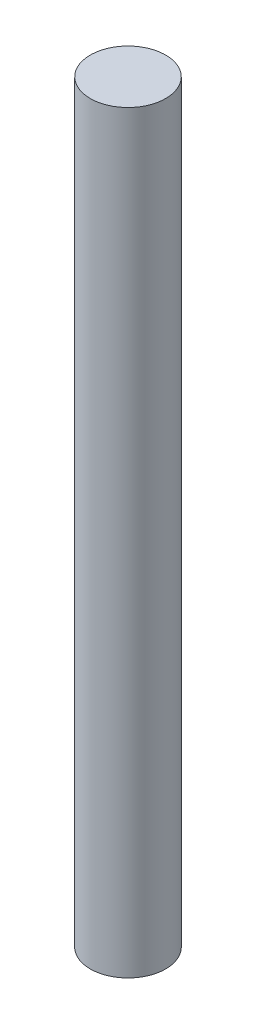
ISO-10303-21;
HEADER;
FILE_DESCRIPTION(('STEP AP214'),'2;1');
FILE_NAME('part.step','',(''),(''),'','','');
FILE_SCHEMA(('AUTOMOTIVE_DESIGN { 1 0 10303 214 1 1 1 1 }'));
ENDSEC;
DATA;
#1=APPLICATION_CONTEXT('core data for automotive mechanical design processes');
#2=APPLICATION_PROTOCOL_DEFINITION('international standard','automotive_design',2000,#1);
#3=PRODUCT_CONTEXT('',#1,'mechanical');
#4=PRODUCT('Part','Part','',(#3));
#5=PRODUCT_RELATED_PRODUCT_CATEGORY('part','',(#4));
#6=PRODUCT_DEFINITION_FORMATION('','',#4);
#7=PRODUCT_DEFINITION_CONTEXT('part definition',#1,'design');
#8=PRODUCT_DEFINITION('design','',#6,#7);
#9=PRODUCT_DEFINITION_SHAPE('','',#8);
#10=(LENGTH_UNIT() NAMED_UNIT(*) SI_UNIT(.MILLI.,.METRE.));
#11=(NAMED_UNIT(*) PLANE_ANGLE_UNIT() SI_UNIT($,.RADIAN.));
#12=(NAMED_UNIT(*) SI_UNIT($,.STERADIAN.) SOLID_ANGLE_UNIT());
#13=UNCERTAINTY_MEASURE_WITH_UNIT(LENGTH_MEASURE(1.E-05),#10,'distance_accuracy_value','');
#14=(GEOMETRIC_REPRESENTATION_CONTEXT(3) GLOBAL_UNCERTAINTY_ASSIGNED_CONTEXT((#13)) GLOBAL_UNIT_ASSIGNED_CONTEXT((#10,
#11,#12)) REPRESENTATION_CONTEXT('',''));
#15=CARTESIAN_POINT('',(0.,0.,0.));
#16=DIRECTION('',(0.,0.,1.));
#17=DIRECTION('',(1.,0.,0.));
#18=AXIS2_PLACEMENT_3D('',#15,#16,#17);
#19=CARTESIAN_POINT('',(0.,50.,0.));
#20=DIRECTION('',(0.,-1.,0.));
#21=DIRECTION('',(0.,0.,-1.));
#22=AXIS2_PLACEMENT_3D('',#19,#20,#21);
#23=CYLINDRICAL_SURFACE('',#22,2.5);
#24=CARTESIAN_POINT('',(0.,50.,0.));
#25=DIRECTION('',(0.,1.,0.));
#26=DIRECTION('',(0.,0.,1.));
#27=AXIS2_PLACEMENT_3D('',#24,#25,#26);
#28=CIRCLE('',#27,2.5);
#29=CARTESIAN_POINT('',(0.,50.,2.5));
#30=VERTEX_POINT('',#29);
#31=EDGE_CURVE('E10',#30,#30,#28,.T.);
#32=ORIENTED_EDGE('',*,*,#31,.F.);
#33=EDGE_LOOP('',(#32));
#34=FACE_BOUND('',#33,.T.);
#35=CARTESIAN_POINT('',(0.,0.,0.));
#36=DIRECTION('',(0.,1.,0.));
#37=DIRECTION('',(0.,0.,1.));
#38=AXIS2_PLACEMENT_3D('',#35,#36,#37);
#39=CIRCLE('',#38,2.5);
#40=CARTESIAN_POINT('',(0.,0.,2.5));
#41=VERTEX_POINT('',#40);
#42=EDGE_CURVE('E40',#41,#41,#39,.T.);
#43=ORIENTED_EDGE('',*,*,#42,.T.);
#44=EDGE_LOOP('',(#43));
#45=FACE_BOUND('',#44,.T.);
#46=ADVANCED_FACE('F37',(#34,#45),#23,.T.);
#47=CARTESIAN_POINT('',(0.,50.,0.));
#48=DIRECTION('',(0.,1.,0.));
#49=DIRECTION('',(0.,0.,1.));
#50=AXIS2_PLACEMENT_3D('',#47,#48,#49);
#51=PLANE('',#50);
#52=ORIENTED_EDGE('',*,*,#31,.T.);
#53=EDGE_LOOP('',(#52));
#54=FACE_BOUND('',#53,.T.);
#55=ADVANCED_FACE('F52',(#54),#51,.T.);
#56=CARTESIAN_POINT('',(0.,0.,0.));
#57=DIRECTION('',(0.,1.,0.));
#58=DIRECTION('',(0.,0.,1.));
#59=AXIS2_PLACEMENT_3D('',#56,#57,#58);
#60=PLANE('',#59);
#61=ORIENTED_EDGE('',*,*,#42,.F.);
#62=EDGE_LOOP('',(#61));
#63=FACE_BOUND('',#62,.T.);
#64=ADVANCED_FACE('F50',(#63),#60,.F.);
#65=CLOSED_SHELL('',(#46,#55,#64));
#66=MANIFOLD_SOLID_BREP('B2',#65);
#67=ADVANCED_BREP_SHAPE_REPRESENTATION('',(#18,#66),#14);
#68=SHAPE_DEFINITION_REPRESENTATION(#9,#67);
ENDSEC;
END-ISO-10303-21;
